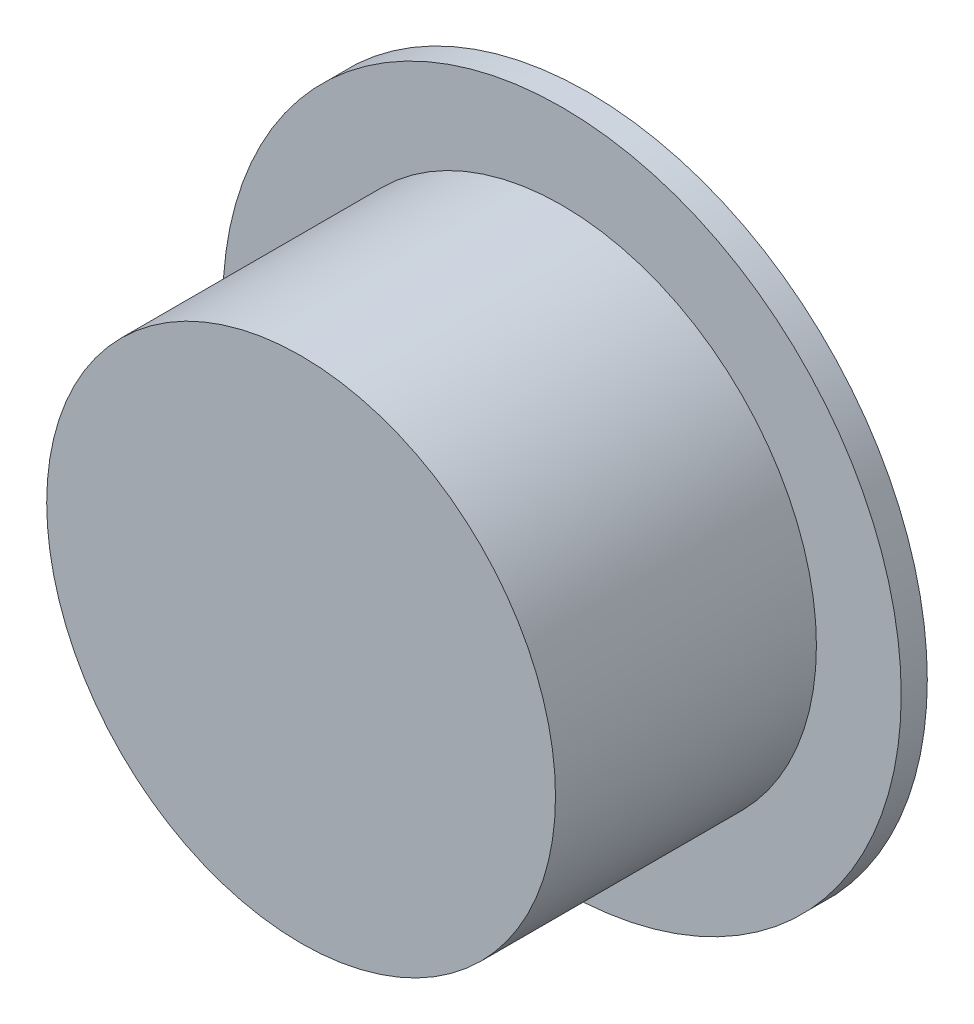
ISO-10303-21;
HEADER;
FILE_DESCRIPTION(('STEP AP214'),'2;1');
FILE_NAME('part.step','',(''),(''),'','','');
FILE_SCHEMA(('AUTOMOTIVE_DESIGN { 1 0 10303 214 1 1 1 1 }'));
ENDSEC;
DATA;
#1=APPLICATION_CONTEXT('core data for automotive mechanical design processes');
#2=APPLICATION_PROTOCOL_DEFINITION('international standard','automotive_design',2000,#1);
#3=PRODUCT_CONTEXT('',#1,'mechanical');
#4=PRODUCT('Part','Part','',(#3));
#5=PRODUCT_RELATED_PRODUCT_CATEGORY('part','',(#4));
#6=PRODUCT_DEFINITION_FORMATION('','',#4);
#7=PRODUCT_DEFINITION_CONTEXT('part definition',#1,'design');
#8=PRODUCT_DEFINITION('design','',#6,#7);
#9=PRODUCT_DEFINITION_SHAPE('','',#8);
#10=(LENGTH_UNIT() NAMED_UNIT(*) SI_UNIT(.MILLI.,.METRE.));
#11=(NAMED_UNIT(*) PLANE_ANGLE_UNIT() SI_UNIT($,.RADIAN.));
#12=(NAMED_UNIT(*) SI_UNIT($,.STERADIAN.) SOLID_ANGLE_UNIT());
#13=UNCERTAINTY_MEASURE_WITH_UNIT(LENGTH_MEASURE(1.E-05),#10,'distance_accuracy_value','');
#14=(GEOMETRIC_REPRESENTATION_CONTEXT(3) GLOBAL_UNCERTAINTY_ASSIGNED_CONTEXT((#13)) GLOBAL_UNIT_ASSIGNED_CONTEXT((#10,
#11,#12)) REPRESENTATION_CONTEXT('',''));
#15=CARTESIAN_POINT('',(0.,0.,0.));
#16=DIRECTION('',(0.,0.,1.));
#17=DIRECTION('',(1.,0.,0.));
#18=AXIS2_PLACEMENT_3D('',#15,#16,#17);
#19=CARTESIAN_POINT('',(0.,0.,5.));
#20=DIRECTION('',(0.,0.,-1.));
#21=DIRECTION('',(-1.,0.,0.));
#22=AXIS2_PLACEMENT_3D('',#19,#20,#21);
#23=CYLINDRICAL_SURFACE('',#22,4.875);
#24=CARTESIAN_POINT('',(0.,0.,5.));
#25=DIRECTION('',(0.,0.,1.));
#26=DIRECTION('',(1.,0.,0.));
#27=AXIS2_PLACEMENT_3D('',#24,#25,#26);
#28=CIRCLE('',#27,4.875);
#29=CARTESIAN_POINT('',(4.875,0.,5.));
#30=VERTEX_POINT('',#29);
#31=EDGE_CURVE('E10',#30,#30,#28,.T.);
#32=ORIENTED_EDGE('',*,*,#31,.F.);
#33=EDGE_LOOP('',(#32));
#34=FACE_BOUND('',#33,.T.);
#35=CARTESIAN_POINT('',(0.,0.,0.));
#36=DIRECTION('',(0.,0.,-1.));
#37=DIRECTION('',(-1.,0.,0.));
#38=AXIS2_PLACEMENT_3D('',#35,#36,#37);
#39=CIRCLE('',#38,4.875);
#40=CARTESIAN_POINT('',(-4.875,0.,0.));
#41=VERTEX_POINT('',#40);
#42=EDGE_CURVE('E37',#41,#41,#39,.T.);
#43=ORIENTED_EDGE('',*,*,#42,.F.);
#44=EDGE_LOOP('',(#43));
#45=FACE_BOUND('',#44,.T.);
#46=ADVANCED_FACE('F31',(#34,#45),#23,.T.);
#47=CARTESIAN_POINT('',(0.,0.,5.));
#48=DIRECTION('',(0.,0.,1.));
#49=DIRECTION('',(1.,0.,0.));
#50=AXIS2_PLACEMENT_3D('',#47,#48,#49);
#51=PLANE('',#50);
#52=ORIENTED_EDGE('',*,*,#31,.T.);
#53=EDGE_LOOP('',(#52));
#54=FACE_BOUND('',#53,.T.);
#55=ADVANCED_FACE('F79',(#54),#51,.T.);
#56=CARTESIAN_POINT('',(0.,0.,0.));
#57=DIRECTION('',(0.,0.,-1.));
#58=DIRECTION('',(-1.,0.,0.));
#59=AXIS2_PLACEMENT_3D('',#56,#57,#58);
#60=PLANE('',#59);
#61=CARTESIAN_POINT('',(0.,0.,0.));
#62=DIRECTION('',(0.,0.,-1.));
#63=DIRECTION('',(-1.,0.,0.));
#64=AXIS2_PLACEMENT_3D('',#61,#62,#63);
#65=CIRCLE('',#64,6.5);
#66=CARTESIAN_POINT('',(-6.5,0.,0.));
#67=VERTEX_POINT('',#66);
#68=EDGE_CURVE('E45',#67,#67,#65,.T.);
#69=ORIENTED_EDGE('',*,*,#68,.F.);
#70=EDGE_LOOP('',(#69));
#71=FACE_BOUND('',#70,.T.);
#72=ORIENTED_EDGE('',*,*,#42,.T.);
#73=EDGE_LOOP('',(#72));
#74=FACE_BOUND('',#73,.T.);
#75=ADVANCED_FACE('F74',(#71,#74),#60,.F.);
#76=CARTESIAN_POINT('',(0.,0.,-0.5));
#77=DIRECTION('',(0.,0.,1.));
#78=DIRECTION('',(1.,0.,0.));
#79=AXIS2_PLACEMENT_3D('',#76,#77,#78);
#80=CYLINDRICAL_SURFACE('',#79,6.5);
#81=CARTESIAN_POINT('',(0.,0.,-0.5));
#82=DIRECTION('',(0.,0.,-1.));
#83=DIRECTION('',(-1.,0.,0.));
#84=AXIS2_PLACEMENT_3D('',#81,#82,#83);
#85=CIRCLE('',#84,6.5);
#86=CARTESIAN_POINT('',(-6.5,0.,-0.5));
#87=VERTEX_POINT('',#86);
#88=EDGE_CURVE('E41',#87,#87,#85,.T.);
#89=ORIENTED_EDGE('',*,*,#88,.F.);
#90=EDGE_LOOP('',(#89));
#91=FACE_BOUND('',#90,.T.);
#92=ORIENTED_EDGE('',*,*,#68,.T.);
#93=EDGE_LOOP('',(#92));
#94=FACE_BOUND('',#93,.T.);
#95=ADVANCED_FACE('F68',(#91,#94),#80,.T.);
#96=CARTESIAN_POINT('',(0.,0.,-0.5));
#97=DIRECTION('',(0.,0.,-1.));
#98=DIRECTION('',(-1.,0.,0.));
#99=AXIS2_PLACEMENT_3D('',#96,#97,#98);
#100=PLANE('',#99);
#101=CARTESIAN_POINT('',(0.,0.,-0.5));
#102=DIRECTION('',(0.,0.,-1.));
#103=DIRECTION('',(-1.,0.,0.));
#104=AXIS2_PLACEMENT_3D('',#101,#102,#103);
#105=CIRCLE('',#104,1.75);
#106=CARTESIAN_POINT('',(-1.75,0.,-0.5));
#107=VERTEX_POINT('',#106);
#108=EDGE_CURVE('E51',#107,#107,#105,.T.);
#109=ORIENTED_EDGE('',*,*,#108,.F.);
#110=EDGE_LOOP('',(#109));
#111=FACE_BOUND('',#110,.T.);
#112=ORIENTED_EDGE('',*,*,#88,.T.);
#113=EDGE_LOOP('',(#112));
#114=FACE_BOUND('',#113,.T.);
#115=ADVANCED_FACE('F62',(#111,#114),#100,.T.);
#116=CARTESIAN_POINT('',(0.,0.,0.25));
#117=DIRECTION('',(0.,0.,-1.));
#118=DIRECTION('',(-1.,0.,0.));
#119=AXIS2_PLACEMENT_3D('',#116,#117,#118);
#120=CYLINDRICAL_SURFACE('',#119,1.75);
#121=CARTESIAN_POINT('',(0.,0.,0.25));
#122=DIRECTION('',(0.,0.,-1.));
#123=DIRECTION('',(-1.,0.,0.));
#124=AXIS2_PLACEMENT_3D('',#121,#122,#123);
#125=CIRCLE('',#124,1.75);
#126=CARTESIAN_POINT('',(-1.75,0.,0.25));
#127=VERTEX_POINT('',#126);
#128=EDGE_CURVE('E49',#127,#127,#125,.T.);
#129=ORIENTED_EDGE('',*,*,#128,.F.);
#130=EDGE_LOOP('',(#129));
#131=FACE_BOUND('',#130,.T.);
#132=ORIENTED_EDGE('',*,*,#108,.T.);
#133=EDGE_LOOP('',(#132));
#134=FACE_BOUND('',#133,.T.);
#135=ADVANCED_FACE('F59',(#131,#134),#120,.F.);
#136=CARTESIAN_POINT('',(0.,0.,0.25));
#137=DIRECTION('',(0.,0.,-1.));
#138=DIRECTION('',(-1.,0.,0.));
#139=AXIS2_PLACEMENT_3D('',#136,#137,#138);
#140=PLANE('',#139);
#141=ORIENTED_EDGE('',*,*,#128,.T.);
#142=EDGE_LOOP('',(#141));
#143=FACE_BOUND('',#142,.T.);
#144=ADVANCED_FACE('F57',(#143),#140,.T.);
#145=CLOSED_SHELL('',(#46,#55,#75,#95,#115,#135,#144));
#146=MANIFOLD_SOLID_BREP('B2',#145);
#147=ADVANCED_BREP_SHAPE_REPRESENTATION('',(#18,#146),#14);
#148=SHAPE_DEFINITION_REPRESENTATION(#9,#147);
ENDSEC;
END-ISO-10303-21;
